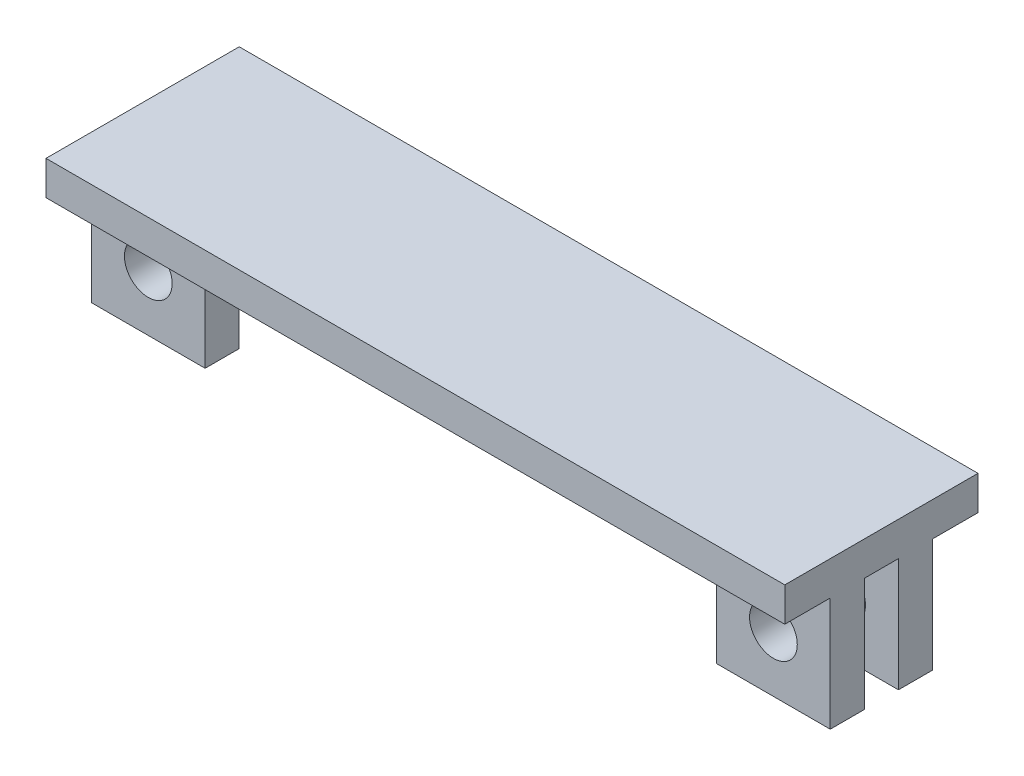
ISO-10303-21;
HEADER;
FILE_DESCRIPTION(('STEP AP214'),'2;1');
FILE_NAME('part.step','',(''),(''),'','','');
FILE_SCHEMA(('AUTOMOTIVE_DESIGN { 1 0 10303 214 1 1 1 1 }'));
ENDSEC;
DATA;
#1=APPLICATION_CONTEXT('core data for automotive mechanical design processes');
#2=APPLICATION_PROTOCOL_DEFINITION('international standard','automotive_design',2000,#1);
#3=PRODUCT_CONTEXT('',#1,'mechanical');
#4=PRODUCT('Part','Part','',(#3));
#5=PRODUCT_RELATED_PRODUCT_CATEGORY('part','',(#4));
#6=PRODUCT_DEFINITION_FORMATION('','',#4);
#7=PRODUCT_DEFINITION_CONTEXT('part definition',#1,'design');
#8=PRODUCT_DEFINITION('design','',#6,#7);
#9=PRODUCT_DEFINITION_SHAPE('','',#8);
#10=(LENGTH_UNIT() NAMED_UNIT(*) SI_UNIT(.MILLI.,.METRE.));
#11=(NAMED_UNIT(*) PLANE_ANGLE_UNIT() SI_UNIT($,.RADIAN.));
#12=(NAMED_UNIT(*) SI_UNIT($,.STERADIAN.) SOLID_ANGLE_UNIT());
#13=UNCERTAINTY_MEASURE_WITH_UNIT(LENGTH_MEASURE(1.E-05),#10,'distance_accuracy_value','');
#14=(GEOMETRIC_REPRESENTATION_CONTEXT(3) GLOBAL_UNCERTAINTY_ASSIGNED_CONTEXT((#13)) GLOBAL_UNIT_ASSIGNED_CONTEXT((#10,
#11,#12)) REPRESENTATION_CONTEXT('',''));
#15=CARTESIAN_POINT('',(0.,0.,0.));
#16=DIRECTION('',(0.,0.,1.));
#17=DIRECTION('',(1.,0.,0.));
#18=AXIS2_PLACEMENT_3D('',#15,#16,#17);
#19=CARTESIAN_POINT('',(-5.,10.,1.5));
#20=DIRECTION('',(0.,0.,-1.));
#21=DIRECTION('',(-1.,0.,0.));
#22=AXIS2_PLACEMENT_3D('',#19,#20,#21);
#23=PLANE('',#22);
#24=CARTESIAN_POINT('',(0.,5.,1.5));
#25=DIRECTION('',(0.,0.,1.));
#26=DIRECTION('',(1.,0.,0.));
#27=AXIS2_PLACEMENT_3D('',#24,#25,#26);
#28=CIRCLE('',#27,2.1);
#29=CARTESIAN_POINT('',(2.1,5.,1.5));
#30=VERTEX_POINT('',#29);
#31=EDGE_CURVE('E237',#30,#30,#28,.T.);
#32=ORIENTED_EDGE('',*,*,#31,.F.);
#33=EDGE_LOOP('',(#32));
#34=FACE_BOUND('',#33,.T.);
#35=DIRECTION('',(1.,0.,0.));
#36=VECTOR('',#35,1.);
#37=CARTESIAN_POINT('',(-5.,10.,1.5));
#38=LINE('',#37,#36);
#39=CARTESIAN_POINT('',(-5.,10.,1.5));
#40=VERTEX_POINT('',#39);
#41=CARTESIAN_POINT('',(5.,10.,1.5));
#42=VERTEX_POINT('',#41);
#43=EDGE_CURVE('E51',#40,#42,#38,.T.);
#44=ORIENTED_EDGE('',*,*,#43,.F.);
#45=DIRECTION('',(0.,-1.,0.));
#46=VECTOR('',#45,1.);
#47=CARTESIAN_POINT('',(-5.,10.,1.5));
#48=LINE('',#47,#46);
#49=CARTESIAN_POINT('',(-5.,0.,1.5));
#50=VERTEX_POINT('',#49);
#51=EDGE_CURVE('E205',#40,#50,#48,.T.);
#52=ORIENTED_EDGE('',*,*,#51,.T.);
#53=DIRECTION('',(1.,0.,0.));
#54=VECTOR('',#53,1.);
#55=CARTESIAN_POINT('',(-5.,0.,1.5));
#56=LINE('',#55,#54);
#57=CARTESIAN_POINT('',(5.,0.,1.5));
#58=VERTEX_POINT('',#57);
#59=EDGE_CURVE('E389',#50,#58,#56,.T.);
#60=ORIENTED_EDGE('',*,*,#59,.T.);
#61=DIRECTION('',(0.,-1.,0.));
#62=VECTOR('',#61,1.);
#63=CARTESIAN_POINT('',(5.,10.,1.5));
#64=LINE('',#63,#62);
#65=EDGE_CURVE('E393',#42,#58,#64,.T.);
#66=ORIENTED_EDGE('',*,*,#65,.F.);
#67=EDGE_LOOP('',(#44,#52,#60,#66));
#68=FACE_BOUND('',#67,.T.);
#69=ADVANCED_FACE('F39',(#34,#68),#23,.F.);
#70=CARTESIAN_POINT('',(55.,5.,1.5));
#71=DIRECTION('',(0.,0.,1.));
#72=DIRECTION('',(1.,0.,0.));
#73=AXIS2_PLACEMENT_3D('',#70,#71,#72);
#74=CIRCLE('',#73,2.1);
#75=CARTESIAN_POINT('',(57.1,5.,1.5));
#76=VERTEX_POINT('',#75);
#77=EDGE_CURVE('E236',#76,#76,#74,.T.);
#78=ORIENTED_EDGE('',*,*,#77,.F.);
#79=EDGE_LOOP('',(#78));
#80=FACE_BOUND('',#79,.T.);
#81=CARTESIAN_POINT('',(50.,10.,1.5));
#82=VERTEX_POINT('',#81);
#83=CARTESIAN_POINT('',(60.,10.,1.5));
#84=VERTEX_POINT('',#83);
#85=EDGE_CURVE('E11',#82,#84,#38,.T.);
#86=ORIENTED_EDGE('',*,*,#85,.F.);
#87=DIRECTION('',(0.,-1.,0.));
#88=VECTOR('',#87,1.);
#89=CARTESIAN_POINT('',(50.,10.,1.5));
#90=LINE('',#89,#88);
#91=CARTESIAN_POINT('',(50.,0.,1.5));
#92=VERTEX_POINT('',#91);
#93=EDGE_CURVE('E337',#82,#92,#90,.T.);
#94=ORIENTED_EDGE('',*,*,#93,.T.);
#95=DIRECTION('',(1.,0.,0.));
#96=VECTOR('',#95,1.);
#97=CARTESIAN_POINT('',(50.,0.,1.5));
#98=LINE('',#97,#96);
#99=CARTESIAN_POINT('',(60.,0.,1.5));
#100=VERTEX_POINT('',#99);
#101=EDGE_CURVE('E333',#92,#100,#98,.T.);
#102=ORIENTED_EDGE('',*,*,#101,.T.);
#103=DIRECTION('',(0.,-1.,0.));
#104=VECTOR('',#103,1.);
#105=CARTESIAN_POINT('',(60.,13.,1.5));
#106=LINE('',#105,#104);
#107=EDGE_CURVE('E380',#84,#100,#106,.T.);
#108=ORIENTED_EDGE('',*,*,#107,.F.);
#109=EDGE_LOOP('',(#86,#94,#102,#108));
#110=FACE_BOUND('',#109,.T.);
#111=ADVANCED_FACE('F436',(#80,#110),#23,.F.);
#112=CARTESIAN_POINT('',(-5.,13.,-7.5));
#113=DIRECTION('',(0.,0.,1.));
#114=DIRECTION('',(1.,0.,0.));
#115=AXIS2_PLACEMENT_3D('',#112,#113,#114);
#116=PLANE('',#115);
#117=CARTESIAN_POINT('',(55.,5.,-7.5));
#118=DIRECTION('',(0.,0.,1.));
#119=DIRECTION('',(1.,0.,0.));
#120=AXIS2_PLACEMENT_3D('',#117,#118,#119);
#121=CIRCLE('',#120,2.1);
#122=CARTESIAN_POINT('',(57.1,5.,-7.5));
#123=VERTEX_POINT('',#122);
#124=EDGE_CURVE('E249',#123,#123,#121,.T.);
#125=ORIENTED_EDGE('',*,*,#124,.T.);
#126=EDGE_LOOP('',(#125));
#127=FACE_BOUND('',#126,.T.);
#128=DIRECTION('',(-1.,0.,0.));
#129=VECTOR('',#128,1.);
#130=CARTESIAN_POINT('',(60.,10.,-7.5));
#131=LINE('',#130,#129);
#132=CARTESIAN_POINT('',(60.,10.,-7.5));
#133=VERTEX_POINT('',#132);
#134=CARTESIAN_POINT('',(50.,10.,-7.5));
#135=VERTEX_POINT('',#134);
#136=EDGE_CURVE('E65',#133,#135,#131,.T.);
#137=ORIENTED_EDGE('',*,*,#136,.F.);
#138=DIRECTION('',(0.,-1.,0.));
#139=VECTOR('',#138,1.);
#140=CARTESIAN_POINT('',(60.,13.,-7.5));
#141=LINE('',#140,#139);
#142=CARTESIAN_POINT('',(60.,0.,-7.5));
#143=VERTEX_POINT('',#142);
#144=EDGE_CURVE('E377',#133,#143,#141,.T.);
#145=ORIENTED_EDGE('',*,*,#144,.T.);
#146=DIRECTION('',(-1.,0.,0.));
#147=VECTOR('',#146,1.);
#148=CARTESIAN_POINT('',(50.,0.,-7.5));
#149=LINE('',#148,#147);
#150=CARTESIAN_POINT('',(50.,0.,-7.5));
#151=VERTEX_POINT('',#150);
#152=EDGE_CURVE('E274',#143,#151,#149,.T.);
#153=ORIENTED_EDGE('',*,*,#152,.T.);
#154=DIRECTION('',(0.,-1.,0.));
#155=VECTOR('',#154,1.);
#156=CARTESIAN_POINT('',(50.,10.,-7.5));
#157=LINE('',#156,#155);
#158=EDGE_CURVE('E289',#135,#151,#157,.T.);
#159=ORIENTED_EDGE('',*,*,#158,.F.);
#160=EDGE_LOOP('',(#137,#145,#153,#159));
#161=FACE_BOUND('',#160,.T.);
#162=ADVANCED_FACE('F433',(#127,#161),#116,.F.);
#163=CARTESIAN_POINT('',(0.,5.,-7.5));
#164=DIRECTION('',(0.,0.,1.));
#165=DIRECTION('',(1.,0.,0.));
#166=AXIS2_PLACEMENT_3D('',#163,#164,#165);
#167=CIRCLE('',#166,2.1);
#168=CARTESIAN_POINT('',(2.1,5.,-7.5));
#169=VERTEX_POINT('',#168);
#170=EDGE_CURVE('E253',#169,#169,#167,.T.);
#171=ORIENTED_EDGE('',*,*,#170,.T.);
#172=EDGE_LOOP('',(#171));
#173=FACE_BOUND('',#172,.T.);
#174=CARTESIAN_POINT('',(5.,10.,-7.5));
#175=VERTEX_POINT('',#174);
#176=CARTESIAN_POINT('',(-5.,10.,-7.5));
#177=VERTEX_POINT('',#176);
#178=EDGE_CURVE('E49',#175,#177,#131,.T.);
#179=ORIENTED_EDGE('',*,*,#178,.F.);
#180=DIRECTION('',(0.,-1.,0.));
#181=VECTOR('',#180,1.);
#182=CARTESIAN_POINT('',(5.,10.,-7.5));
#183=LINE('',#182,#181);
#184=CARTESIAN_POINT('',(5.,0.,-7.5));
#185=VERTEX_POINT('',#184);
#186=EDGE_CURVE('E323',#175,#185,#183,.T.);
#187=ORIENTED_EDGE('',*,*,#186,.T.);
#188=DIRECTION('',(-1.,0.,0.));
#189=VECTOR('',#188,1.);
#190=CARTESIAN_POINT('',(-5.,0.,-7.5));
#191=LINE('',#190,#189);
#192=CARTESIAN_POINT('',(-5.,0.,-7.5));
#193=VERTEX_POINT('',#192);
#194=EDGE_CURVE('E307',#185,#193,#191,.T.);
#195=ORIENTED_EDGE('',*,*,#194,.T.);
#196=DIRECTION('',(0.,-1.,0.));
#197=VECTOR('',#196,1.);
#198=CARTESIAN_POINT('',(-5.,13.,-7.5));
#199=LINE('',#198,#197);
#200=EDGE_CURVE('E369',#177,#193,#199,.T.);
#201=ORIENTED_EDGE('',*,*,#200,.F.);
#202=EDGE_LOOP('',(#179,#187,#195,#201));
#203=FACE_BOUND('',#202,.T.);
#204=ADVANCED_FACE('F435',(#173,#203),#116,.F.);
#205=CARTESIAN_POINT('',(0.,10.,0.));
#206=DIRECTION('',(0.,1.,0.));
#207=DIRECTION('',(0.,0.,1.));
#208=AXIS2_PLACEMENT_3D('',#205,#206,#207);
#209=PLANE('',#208);
#210=DIRECTION('',(0.,0.,1.));
#211=VECTOR('',#210,1.);
#212=CARTESIAN_POINT('',(50.,10.,-4.5));
#213=LINE('',#212,#211);
#214=CARTESIAN_POINT('',(50.,10.,-4.5));
#215=VERTEX_POINT('',#214);
#216=EDGE_CURVE('E262',#135,#215,#213,.T.);
#217=ORIENTED_EDGE('',*,*,#216,.T.);
#218=DIRECTION('',(1.,0.,0.));
#219=VECTOR('',#218,1.);
#220=CARTESIAN_POINT('',(50.,10.,-4.5));
#221=LINE('',#220,#219);
#222=CARTESIAN_POINT('',(60.,10.,-4.5));
#223=VERTEX_POINT('',#222);
#224=EDGE_CURVE('E265',#215,#223,#221,.T.);
#225=ORIENTED_EDGE('',*,*,#224,.T.);
#226=DIRECTION('',(0.,0.,-1.));
#227=VECTOR('',#226,1.);
#228=CARTESIAN_POINT('',(60.,10.,-7.5));
#229=LINE('',#228,#227);
#230=CARTESIAN_POINT('',(60.,10.,-1.5));
#231=VERTEX_POINT('',#230);
#232=EDGE_CURVE('E366',#231,#223,#229,.T.);
#233=ORIENTED_EDGE('',*,*,#232,.F.);
#234=DIRECTION('',(-1.,0.,0.));
#235=VECTOR('',#234,1.);
#236=CARTESIAN_POINT('',(50.,10.,-1.5));
#237=LINE('',#236,#235);
#238=CARTESIAN_POINT('',(50.,10.,-1.5));
#239=VERTEX_POINT('',#238);
#240=EDGE_CURVE('E328',#231,#239,#237,.T.);
#241=ORIENTED_EDGE('',*,*,#240,.T.);
#242=DIRECTION('',(0.,0.,1.));
#243=VECTOR('',#242,1.);
#244=CARTESIAN_POINT('',(50.,10.,1.5));
#245=LINE('',#244,#243);
#246=EDGE_CURVE('E332',#239,#82,#245,.T.);
#247=ORIENTED_EDGE('',*,*,#246,.T.);
#248=ORIENTED_EDGE('',*,*,#85,.T.);
#249=DIRECTION('',(0.,0.,-1.));
#250=VECTOR('',#249,1.);
#251=CARTESIAN_POINT('',(60.,10.,5.5));
#252=LINE('',#251,#250);
#253=CARTESIAN_POINT('',(60.,10.,5.5));
#254=VERTEX_POINT('',#253);
#255=EDGE_CURVE('E187',#254,#84,#252,.T.);
#256=ORIENTED_EDGE('',*,*,#255,.F.);
#257=DIRECTION('',(1.,0.,0.));
#258=VECTOR('',#257,1.);
#259=CARTESIAN_POINT('',(-5.,10.,5.5));
#260=LINE('',#259,#258);
#261=CARTESIAN_POINT('',(-5.,10.,5.5));
#262=VERTEX_POINT('',#261);
#263=EDGE_CURVE('E180',#262,#254,#260,.T.);
#264=ORIENTED_EDGE('',*,*,#263,.F.);
#265=DIRECTION('',(0.,0.,-1.));
#266=VECTOR('',#265,1.);
#267=CARTESIAN_POINT('',(-5.,10.,5.5));
#268=LINE('',#267,#266);
#269=EDGE_CURVE('E185',#262,#40,#268,.T.);
#270=ORIENTED_EDGE('',*,*,#269,.T.);
#271=ORIENTED_EDGE('',*,*,#43,.T.);
#272=DIRECTION('',(0.,0.,-1.));
#273=VECTOR('',#272,1.);
#274=CARTESIAN_POINT('',(5.,10.,1.5));
#275=LINE('',#274,#273);
#276=CARTESIAN_POINT('',(5.,10.,-1.5));
#277=VERTEX_POINT('',#276);
#278=EDGE_CURVE('E384',#42,#277,#275,.T.);
#279=ORIENTED_EDGE('',*,*,#278,.T.);
#280=DIRECTION('',(-1.,0.,0.));
#281=VECTOR('',#280,1.);
#282=CARTESIAN_POINT('',(-5.,10.,-1.5));
#283=LINE('',#282,#281);
#284=CARTESIAN_POINT('',(-5.,10.,-1.5));
#285=VERTEX_POINT('',#284);
#286=EDGE_CURVE('E388',#277,#285,#283,.T.);
#287=ORIENTED_EDGE('',*,*,#286,.T.);
#288=DIRECTION('',(0.,0.,1.));
#289=VECTOR('',#288,1.);
#290=CARTESIAN_POINT('',(-5.,10.,-7.5));
#291=LINE('',#290,#289);
#292=CARTESIAN_POINT('',(-5.,10.,-4.5));
#293=VERTEX_POINT('',#292);
#294=EDGE_CURVE('E361',#293,#285,#291,.T.);
#295=ORIENTED_EDGE('',*,*,#294,.F.);
#296=DIRECTION('',(1.,0.,0.));
#297=VECTOR('',#296,1.);
#298=CARTESIAN_POINT('',(-5.,10.,-4.5));
#299=LINE('',#298,#297);
#300=CARTESIAN_POINT('',(5.,10.,-4.5));
#301=VERTEX_POINT('',#300);
#302=EDGE_CURVE('E298',#293,#301,#299,.T.);
#303=ORIENTED_EDGE('',*,*,#302,.T.);
#304=DIRECTION('',(0.,0.,-1.));
#305=VECTOR('',#304,1.);
#306=CARTESIAN_POINT('',(5.,10.,-4.5));
#307=LINE('',#306,#305);
#308=EDGE_CURVE('E294',#301,#175,#307,.T.);
#309=ORIENTED_EDGE('',*,*,#308,.T.);
#310=ORIENTED_EDGE('',*,*,#178,.T.);
#311=DIRECTION('',(0.,0.,1.));
#312=VECTOR('',#311,1.);
#313=CARTESIAN_POINT('',(-5.,10.,-11.5));
#314=LINE('',#313,#312);
#315=CARTESIAN_POINT('',(-5.,10.,-11.5));
#316=VERTEX_POINT('',#315);
#317=EDGE_CURVE('E227',#316,#177,#314,.T.);
#318=ORIENTED_EDGE('',*,*,#317,.F.);
#319=DIRECTION('',(-1.,0.,0.));
#320=VECTOR('',#319,1.);
#321=CARTESIAN_POINT('',(60.,10.,-11.5));
#322=LINE('',#321,#320);
#323=CARTESIAN_POINT('',(60.,10.,-11.5));
#324=VERTEX_POINT('',#323);
#325=EDGE_CURVE('E217',#324,#316,#322,.T.);
#326=ORIENTED_EDGE('',*,*,#325,.F.);
#327=DIRECTION('',(0.,0.,1.));
#328=VECTOR('',#327,1.);
#329=CARTESIAN_POINT('',(60.,10.,-11.5));
#330=LINE('',#329,#328);
#331=EDGE_CURVE('E232',#324,#133,#330,.T.);
#332=ORIENTED_EDGE('',*,*,#331,.T.);
#333=ORIENTED_EDGE('',*,*,#136,.T.);
#334=EDGE_LOOP('',(#217,#225,#233,#241,#247,#248,#256,#264,#270,#271,#279,#287,#295,#303,#309,
#310,#318,#326,#332,#333));
#335=FACE_BOUND('',#334,.T.);
#336=ADVANCED_FACE('F183',(#335),#209,.F.);
#337=CARTESIAN_POINT('',(5.,10.,1.5));
#338=DIRECTION('',(-1.,0.,0.));
#339=DIRECTION('',(0.,0.,1.));
#340=AXIS2_PLACEMENT_3D('',#337,#338,#339);
#341=PLANE('',#340);
#342=DIRECTION('',(0.,0.,-1.));
#343=VECTOR('',#342,1.);
#344=CARTESIAN_POINT('',(5.,0.,1.5));
#345=LINE('',#344,#343);
#346=CARTESIAN_POINT('',(5.,0.,-1.5));
#347=VERTEX_POINT('',#346);
#348=EDGE_CURVE('E383',#58,#347,#345,.T.);
#349=ORIENTED_EDGE('',*,*,#348,.T.);
#350=DIRECTION('',(0.,-1.,0.));
#351=VECTOR('',#350,1.);
#352=CARTESIAN_POINT('',(5.,10.,-1.5));
#353=LINE('',#352,#351);
#354=EDGE_CURVE('E414',#277,#347,#353,.T.);
#355=ORIENTED_EDGE('',*,*,#354,.F.);
#356=ORIENTED_EDGE('',*,*,#278,.F.);
#357=ORIENTED_EDGE('',*,*,#65,.T.);
#358=EDGE_LOOP('',(#349,#355,#356,#357));
#359=FACE_BOUND('',#358,.T.);
#360=ADVANCED_FACE('F41',(#359),#341,.F.);
#361=CARTESIAN_POINT('',(-5.,10.,-1.5));
#362=DIRECTION('',(0.,0.,1.));
#363=DIRECTION('',(1.,0.,0.));
#364=AXIS2_PLACEMENT_3D('',#361,#362,#363);
#365=PLANE('',#364);
#366=CARTESIAN_POINT('',(0.,5.,-1.5));
#367=DIRECTION('',(0.,0.,1.));
#368=DIRECTION('',(1.,0.,0.));
#369=AXIS2_PLACEMENT_3D('',#366,#367,#368);
#370=CIRCLE('',#369,2.1);
#371=CARTESIAN_POINT('',(2.1,5.,-1.5));
#372=VERTEX_POINT('',#371);
#373=EDGE_CURVE('E257',#372,#372,#370,.T.);
#374=ORIENTED_EDGE('',*,*,#373,.T.);
#375=EDGE_LOOP('',(#374));
#376=FACE_BOUND('',#375,.T.);
#377=DIRECTION('',(-1.,0.,0.));
#378=VECTOR('',#377,1.);
#379=CARTESIAN_POINT('',(-5.,0.,-1.5));
#380=LINE('',#379,#378);
#381=CARTESIAN_POINT('',(-5.,0.,-1.5));
#382=VERTEX_POINT('',#381);
#383=EDGE_CURVE('E397',#347,#382,#380,.T.);
#384=ORIENTED_EDGE('',*,*,#383,.T.);
#385=DIRECTION('',(0.,-1.,0.));
#386=VECTOR('',#385,1.);
#387=CARTESIAN_POINT('',(-5.,10.,-1.5));
#388=LINE('',#387,#386);
#389=EDGE_CURVE('E410',#285,#382,#388,.T.);
#390=ORIENTED_EDGE('',*,*,#389,.F.);
#391=ORIENTED_EDGE('',*,*,#286,.F.);
#392=ORIENTED_EDGE('',*,*,#354,.T.);
#393=EDGE_LOOP('',(#384,#390,#391,#392));
#394=FACE_BOUND('',#393,.T.);
#395=ADVANCED_FACE('F456',(#376,#394),#365,.F.);
#396=CARTESIAN_POINT('',(-5.,10.,1.5));
#397=DIRECTION('',(1.,0.,0.));
#398=DIRECTION('',(0.,0.,-1.));
#399=AXIS2_PLACEMENT_3D('',#396,#397,#398);
#400=PLANE('',#399);
#401=DIRECTION('',(0.,0.,1.));
#402=VECTOR('',#401,1.);
#403=CARTESIAN_POINT('',(-5.,0.,1.5));
#404=LINE('',#403,#402);
#405=EDGE_CURVE('E400',#382,#50,#404,.T.);
#406=ORIENTED_EDGE('',*,*,#405,.T.);
#407=ORIENTED_EDGE('',*,*,#51,.F.);
#408=ORIENTED_EDGE('',*,*,#269,.F.);
#409=DIRECTION('',(0.,-1.,0.));
#410=VECTOR('',#409,1.);
#411=CARTESIAN_POINT('',(-5.,13.,5.5));
#412=LINE('',#411,#410);
#413=CARTESIAN_POINT('',(-5.,13.,5.5));
#414=VERTEX_POINT('',#413);
#415=EDGE_CURVE('E193',#414,#262,#412,.T.);
#416=ORIENTED_EDGE('',*,*,#415,.F.);
#417=DIRECTION('',(0.,0.,1.));
#418=VECTOR('',#417,1.);
#419=CARTESIAN_POINT('',(-5.,13.,-7.5));
#420=LINE('',#419,#418);
#421=CARTESIAN_POINT('',(-5.,13.,-11.5));
#422=VERTEX_POINT('',#421);
#423=EDGE_CURVE('E362',#422,#414,#420,.T.);
#424=ORIENTED_EDGE('',*,*,#423,.F.);
#425=DIRECTION('',(0.,1.,0.));
#426=VECTOR('',#425,1.);
#427=CARTESIAN_POINT('',(-5.,13.,-11.5));
#428=LINE('',#427,#426);
#429=EDGE_CURVE('E220',#316,#422,#428,.T.);
#430=ORIENTED_EDGE('',*,*,#429,.F.);
#431=ORIENTED_EDGE('',*,*,#317,.T.);
#432=ORIENTED_EDGE('',*,*,#200,.T.);
#433=DIRECTION('',(0.,0.,1.));
#434=VECTOR('',#433,1.);
#435=CARTESIAN_POINT('',(-5.,0.,-4.5));
#436=LINE('',#435,#434);
#437=CARTESIAN_POINT('',(-5.,0.,-4.5));
#438=VERTEX_POINT('',#437);
#439=EDGE_CURVE('E311',#193,#438,#436,.T.);
#440=ORIENTED_EDGE('',*,*,#439,.T.);
#441=DIRECTION('',(0.,-1.,0.));
#442=VECTOR('',#441,1.);
#443=CARTESIAN_POINT('',(-5.,10.,-4.5));
#444=LINE('',#443,#442);
#445=EDGE_CURVE('E319',#293,#438,#444,.T.);
#446=ORIENTED_EDGE('',*,*,#445,.F.);
#447=ORIENTED_EDGE('',*,*,#294,.T.);
#448=ORIENTED_EDGE('',*,*,#389,.T.);
#449=EDGE_LOOP('',(#406,#407,#408,#416,#424,#430,#431,#432,#440,#446,#447,#448));
#450=FACE_BOUND('',#449,.T.);
#451=ADVANCED_FACE('F204',(#450),#400,.F.);
#452=CARTESIAN_POINT('',(0.,0.,0.));
#453=DIRECTION('',(0.,-1.,0.));
#454=DIRECTION('',(0.,0.,-1.));
#455=AXIS2_PLACEMENT_3D('',#452,#453,#454);
#456=PLANE('',#455);
#457=ORIENTED_EDGE('',*,*,#348,.F.);
#458=ORIENTED_EDGE('',*,*,#59,.F.);
#459=ORIENTED_EDGE('',*,*,#405,.F.);
#460=ORIENTED_EDGE('',*,*,#383,.F.);
#461=EDGE_LOOP('',(#457,#458,#459,#460));
#462=FACE_BOUND('',#461,.T.);
#463=ADVANCED_FACE('F454',(#462),#456,.T.);
#464=CARTESIAN_POINT('',(60.,13.,-7.5));
#465=DIRECTION('',(-1.,0.,0.));
#466=DIRECTION('',(0.,0.,1.));
#467=AXIS2_PLACEMENT_3D('',#464,#465,#466);
#468=PLANE('',#467);
#469=DIRECTION('',(0.,0.,-1.));
#470=VECTOR('',#469,1.);
#471=CARTESIAN_POINT('',(60.,13.,-7.5));
#472=LINE('',#471,#470);
#473=CARTESIAN_POINT('',(60.,13.,5.5));
#474=VERTEX_POINT('',#473);
#475=CARTESIAN_POINT('',(60.,13.,-11.5));
#476=VERTEX_POINT('',#475);
#477=EDGE_CURVE('E365',#474,#476,#472,.T.);
#478=ORIENTED_EDGE('',*,*,#477,.F.);
#479=DIRECTION('',(0.,1.,0.));
#480=VECTOR('',#479,1.);
#481=CARTESIAN_POINT('',(60.,13.,5.5));
#482=LINE('',#481,#480);
#483=EDGE_CURVE('E192',#254,#474,#482,.T.);
#484=ORIENTED_EDGE('',*,*,#483,.F.);
#485=ORIENTED_EDGE('',*,*,#255,.T.);
#486=ORIENTED_EDGE('',*,*,#107,.T.);
#487=DIRECTION('',(0.,0.,-1.));
#488=VECTOR('',#487,1.);
#489=CARTESIAN_POINT('',(60.,0.,1.5));
#490=LINE('',#489,#488);
#491=CARTESIAN_POINT('',(60.,0.,-1.5));
#492=VERTEX_POINT('',#491);
#493=EDGE_CURVE('E327',#100,#492,#490,.T.);
#494=ORIENTED_EDGE('',*,*,#493,.T.);
#495=DIRECTION('',(0.,-1.,0.));
#496=VECTOR('',#495,1.);
#497=CARTESIAN_POINT('',(60.,10.,-1.5));
#498=LINE('',#497,#496);
#499=EDGE_CURVE('E357',#231,#492,#498,.T.);
#500=ORIENTED_EDGE('',*,*,#499,.F.);
#501=ORIENTED_EDGE('',*,*,#232,.T.);
#502=DIRECTION('',(0.,-1.,0.));
#503=VECTOR('',#502,1.);
#504=CARTESIAN_POINT('',(60.,10.,-4.5));
#505=LINE('',#504,#503);
#506=CARTESIAN_POINT('',(60.,0.,-4.5));
#507=VERTEX_POINT('',#506);
#508=EDGE_CURVE('E270',#223,#507,#505,.T.);
#509=ORIENTED_EDGE('',*,*,#508,.T.);
#510=DIRECTION('',(0.,0.,-1.));
#511=VECTOR('',#510,1.);
#512=CARTESIAN_POINT('',(60.,0.,-4.5));
#513=LINE('',#512,#511);
#514=EDGE_CURVE('E261',#507,#143,#513,.T.);
#515=ORIENTED_EDGE('',*,*,#514,.T.);
#516=ORIENTED_EDGE('',*,*,#144,.F.);
#517=ORIENTED_EDGE('',*,*,#331,.F.);
#518=DIRECTION('',(0.,-1.,0.));
#519=VECTOR('',#518,1.);
#520=CARTESIAN_POINT('',(60.,13.,-11.5));
#521=LINE('',#520,#519);
#522=EDGE_CURVE('E210',#476,#324,#521,.T.);
#523=ORIENTED_EDGE('',*,*,#522,.F.);
#524=EDGE_LOOP('',(#478,#484,#485,#486,#494,#500,#501,#509,#515,#516,#517,#523));
#525=FACE_BOUND('',#524,.T.);
#526=ADVANCED_FACE('F524',(#525),#468,.F.);
#527=CARTESIAN_POINT('',(0.,13.,0.));
#528=DIRECTION('',(0.,1.,0.));
#529=DIRECTION('',(0.,0.,1.));
#530=AXIS2_PLACEMENT_3D('',#527,#528,#529);
#531=PLANE('',#530);
#532=ORIENTED_EDGE('',*,*,#423,.T.);
#533=DIRECTION('',(-1.,0.,0.));
#534=VECTOR('',#533,1.);
#535=CARTESIAN_POINT('',(-5.,13.,5.5));
#536=LINE('',#535,#534);
#537=EDGE_CURVE('E199',#474,#414,#536,.T.);
#538=ORIENTED_EDGE('',*,*,#537,.F.);
#539=ORIENTED_EDGE('',*,*,#477,.T.);
#540=DIRECTION('',(1.,0.,0.));
#541=VECTOR('',#540,1.);
#542=CARTESIAN_POINT('',(60.,13.,-11.5));
#543=LINE('',#542,#541);
#544=EDGE_CURVE('E224',#422,#476,#543,.T.);
#545=ORIENTED_EDGE('',*,*,#544,.F.);
#546=EDGE_LOOP('',(#532,#538,#539,#545));
#547=FACE_BOUND('',#546,.T.);
#548=ADVANCED_FACE('F480',(#547),#531,.T.);
#549=CARTESIAN_POINT('',(50.,10.,-1.5));
#550=DIRECTION('',(0.,0.,1.));
#551=DIRECTION('',(1.,0.,0.));
#552=AXIS2_PLACEMENT_3D('',#549,#550,#551);
#553=PLANE('',#552);
#554=CARTESIAN_POINT('',(55.,5.,-1.5));
#555=DIRECTION('',(0.,0.,1.));
#556=DIRECTION('',(1.,0.,0.));
#557=AXIS2_PLACEMENT_3D('',#554,#555,#556);
#558=CIRCLE('',#557,2.1);
#559=CARTESIAN_POINT('',(57.1,5.,-1.5));
#560=VERTEX_POINT('',#559);
#561=EDGE_CURVE('E245',#560,#560,#558,.T.);
#562=ORIENTED_EDGE('',*,*,#561,.T.);
#563=EDGE_LOOP('',(#562));
#564=FACE_BOUND('',#563,.T.);
#565=DIRECTION('',(-1.,0.,0.));
#566=VECTOR('',#565,1.);
#567=CARTESIAN_POINT('',(50.,0.,-1.5));
#568=LINE('',#567,#566);
#569=CARTESIAN_POINT('',(50.,0.,-1.5));
#570=VERTEX_POINT('',#569);
#571=EDGE_CURVE('E341',#492,#570,#568,.T.);
#572=ORIENTED_EDGE('',*,*,#571,.T.);
#573=DIRECTION('',(0.,-1.,0.));
#574=VECTOR('',#573,1.);
#575=CARTESIAN_POINT('',(50.,10.,-1.5));
#576=LINE('',#575,#574);
#577=EDGE_CURVE('E353',#239,#570,#576,.T.);
#578=ORIENTED_EDGE('',*,*,#577,.F.);
#579=ORIENTED_EDGE('',*,*,#240,.F.);
#580=ORIENTED_EDGE('',*,*,#499,.T.);
#581=EDGE_LOOP('',(#572,#578,#579,#580));
#582=FACE_BOUND('',#581,.T.);
#583=ADVANCED_FACE('F518',(#564,#582),#553,.F.);
#584=CARTESIAN_POINT('',(50.,10.,1.5));
#585=DIRECTION('',(1.,0.,0.));
#586=DIRECTION('',(0.,0.,-1.));
#587=AXIS2_PLACEMENT_3D('',#584,#585,#586);
#588=PLANE('',#587);
#589=DIRECTION('',(0.,0.,1.));
#590=VECTOR('',#589,1.);
#591=CARTESIAN_POINT('',(50.,0.,1.5));
#592=LINE('',#591,#590);
#593=EDGE_CURVE('E344',#570,#92,#592,.T.);
#594=ORIENTED_EDGE('',*,*,#593,.T.);
#595=ORIENTED_EDGE('',*,*,#93,.F.);
#596=ORIENTED_EDGE('',*,*,#246,.F.);
#597=ORIENTED_EDGE('',*,*,#577,.T.);
#598=EDGE_LOOP('',(#594,#595,#596,#597));
#599=FACE_BOUND('',#598,.T.);
#600=ADVANCED_FACE('F511',(#599),#588,.F.);
#601=CARTESIAN_POINT('',(0.,0.,0.));
#602=DIRECTION('',(0.,-1.,0.));
#603=DIRECTION('',(0.,0.,-1.));
#604=AXIS2_PLACEMENT_3D('',#601,#602,#603);
#605=PLANE('',#604);
#606=ORIENTED_EDGE('',*,*,#493,.F.);
#607=ORIENTED_EDGE('',*,*,#101,.F.);
#608=ORIENTED_EDGE('',*,*,#593,.F.);
#609=ORIENTED_EDGE('',*,*,#571,.F.);
#610=EDGE_LOOP('',(#606,#607,#608,#609));
#611=FACE_BOUND('',#610,.T.);
#612=ADVANCED_FACE('F503',(#611),#605,.T.);
#613=CARTESIAN_POINT('',(5.,10.,-4.5));
#614=DIRECTION('',(-1.,0.,0.));
#615=DIRECTION('',(0.,0.,1.));
#616=AXIS2_PLACEMENT_3D('',#613,#614,#615);
#617=PLANE('',#616);
#618=DIRECTION('',(0.,0.,-1.));
#619=VECTOR('',#618,1.);
#620=CARTESIAN_POINT('',(5.,0.,-4.5));
#621=LINE('',#620,#619);
#622=CARTESIAN_POINT('',(5.,0.,-4.5));
#623=VERTEX_POINT('',#622);
#624=EDGE_CURVE('E293',#623,#185,#621,.T.);
#625=ORIENTED_EDGE('',*,*,#624,.T.);
#626=ORIENTED_EDGE('',*,*,#186,.F.);
#627=ORIENTED_EDGE('',*,*,#308,.F.);
#628=DIRECTION('',(0.,-1.,0.));
#629=VECTOR('',#628,1.);
#630=CARTESIAN_POINT('',(5.,10.,-4.5));
#631=LINE('',#630,#629);
#632=EDGE_CURVE('E303',#301,#623,#631,.T.);
#633=ORIENTED_EDGE('',*,*,#632,.T.);
#634=EDGE_LOOP('',(#625,#626,#627,#633));
#635=FACE_BOUND('',#634,.T.);
#636=ADVANCED_FACE('F501',(#635),#617,.F.);
#637=CARTESIAN_POINT('',(-5.,10.,-4.5));
#638=DIRECTION('',(0.,0.,-1.));
#639=DIRECTION('',(-1.,0.,0.));
#640=AXIS2_PLACEMENT_3D('',#637,#638,#639);
#641=PLANE('',#640);
#642=CARTESIAN_POINT('',(0.,5.,-4.5));
#643=DIRECTION('',(0.,0.,-1.));
#644=DIRECTION('',(-1.,0.,0.));
#645=AXIS2_PLACEMENT_3D('',#642,#643,#644);
#646=CIRCLE('',#645,2.1);
#647=CARTESIAN_POINT('',(-2.1,5.,-4.5));
#648=VERTEX_POINT('',#647);
#649=EDGE_CURVE('E43',#648,#648,#646,.T.);
#650=ORIENTED_EDGE('',*,*,#649,.T.);
#651=EDGE_LOOP('',(#650));
#652=FACE_BOUND('',#651,.T.);
#653=DIRECTION('',(1.,0.,0.));
#654=VECTOR('',#653,1.);
#655=CARTESIAN_POINT('',(-5.,0.,-4.5));
#656=LINE('',#655,#654);
#657=EDGE_CURVE('E299',#438,#623,#656,.T.);
#658=ORIENTED_EDGE('',*,*,#657,.T.);
#659=ORIENTED_EDGE('',*,*,#632,.F.);
#660=ORIENTED_EDGE('',*,*,#302,.F.);
#661=ORIENTED_EDGE('',*,*,#445,.T.);
#662=EDGE_LOOP('',(#658,#659,#660,#661));
#663=FACE_BOUND('',#662,.T.);
#664=ADVANCED_FACE('F497',(#652,#663),#641,.F.);
#665=CARTESIAN_POINT('',(0.,0.,0.));
#666=DIRECTION('',(0.,-1.,0.));
#667=DIRECTION('',(0.,0.,-1.));
#668=AXIS2_PLACEMENT_3D('',#665,#666,#667);
#669=PLANE('',#668);
#670=ORIENTED_EDGE('',*,*,#624,.F.);
#671=ORIENTED_EDGE('',*,*,#657,.F.);
#672=ORIENTED_EDGE('',*,*,#439,.F.);
#673=ORIENTED_EDGE('',*,*,#194,.F.);
#674=EDGE_LOOP('',(#670,#671,#672,#673));
#675=FACE_BOUND('',#674,.T.);
#676=ADVANCED_FACE('F495',(#675),#669,.T.);
#677=CARTESIAN_POINT('',(50.,10.,-4.5));
#678=DIRECTION('',(1.,0.,0.));
#679=DIRECTION('',(0.,0.,-1.));
#680=AXIS2_PLACEMENT_3D('',#677,#678,#679);
#681=PLANE('',#680);
#682=DIRECTION('',(0.,0.,1.));
#683=VECTOR('',#682,1.);
#684=CARTESIAN_POINT('',(50.,0.,-4.5));
#685=LINE('',#684,#683);
#686=CARTESIAN_POINT('',(50.,0.,-4.5));
#687=VERTEX_POINT('',#686);
#688=EDGE_CURVE('E277',#151,#687,#685,.T.);
#689=ORIENTED_EDGE('',*,*,#688,.T.);
#690=DIRECTION('',(0.,-1.,0.));
#691=VECTOR('',#690,1.);
#692=CARTESIAN_POINT('',(50.,10.,-4.5));
#693=LINE('',#692,#691);
#694=EDGE_CURVE('E285',#215,#687,#693,.T.);
#695=ORIENTED_EDGE('',*,*,#694,.F.);
#696=ORIENTED_EDGE('',*,*,#216,.F.);
#697=ORIENTED_EDGE('',*,*,#158,.T.);
#698=EDGE_LOOP('',(#689,#695,#696,#697));
#699=FACE_BOUND('',#698,.T.);
#700=ADVANCED_FACE('F622',(#699),#681,.F.);
#701=CARTESIAN_POINT('',(50.,10.,-4.5));
#702=DIRECTION('',(0.,0.,-1.));
#703=DIRECTION('',(-1.,0.,0.));
#704=AXIS2_PLACEMENT_3D('',#701,#702,#703);
#705=PLANE('',#704);
#706=CARTESIAN_POINT('',(55.,5.,-4.5));
#707=DIRECTION('',(0.,0.,-1.));
#708=DIRECTION('',(-1.,0.,0.));
#709=AXIS2_PLACEMENT_3D('',#706,#707,#708);
#710=CIRCLE('',#709,2.1);
#711=CARTESIAN_POINT('',(52.9,5.,-4.5));
#712=VERTEX_POINT('',#711);
#713=EDGE_CURVE('E241',#712,#712,#710,.T.);
#714=ORIENTED_EDGE('',*,*,#713,.T.);
#715=EDGE_LOOP('',(#714));
#716=FACE_BOUND('',#715,.T.);
#717=DIRECTION('',(1.,0.,0.));
#718=VECTOR('',#717,1.);
#719=CARTESIAN_POINT('',(50.,0.,-4.5));
#720=LINE('',#719,#718);
#721=EDGE_CURVE('E266',#687,#507,#720,.T.);
#722=ORIENTED_EDGE('',*,*,#721,.T.);
#723=ORIENTED_EDGE('',*,*,#508,.F.);
#724=ORIENTED_EDGE('',*,*,#224,.F.);
#725=ORIENTED_EDGE('',*,*,#694,.T.);
#726=EDGE_LOOP('',(#722,#723,#724,#725));
#727=FACE_BOUND('',#726,.T.);
#728=ADVANCED_FACE('F421',(#716,#727),#705,.F.);
#729=CARTESIAN_POINT('',(0.,0.,0.));
#730=DIRECTION('',(0.,-1.,0.));
#731=DIRECTION('',(0.,0.,-1.));
#732=AXIS2_PLACEMENT_3D('',#729,#730,#731);
#733=PLANE('',#732);
#734=ORIENTED_EDGE('',*,*,#514,.F.);
#735=ORIENTED_EDGE('',*,*,#721,.F.);
#736=ORIENTED_EDGE('',*,*,#688,.F.);
#737=ORIENTED_EDGE('',*,*,#152,.F.);
#738=EDGE_LOOP('',(#734,#735,#736,#737));
#739=FACE_BOUND('',#738,.T.);
#740=ADVANCED_FACE('F428',(#739),#733,.T.);
#741=CARTESIAN_POINT('',(55.,5.,-15.5));
#742=DIRECTION('',(0.,0.,1.));
#743=DIRECTION('',(1.,0.,0.));
#744=AXIS2_PLACEMENT_3D('',#741,#742,#743);
#745=CYLINDRICAL_SURFACE('',#744,2.1);
#746=ORIENTED_EDGE('',*,*,#713,.F.);
#747=EDGE_LOOP('',(#746));
#748=FACE_BOUND('',#747,.T.);
#749=ORIENTED_EDGE('',*,*,#124,.F.);
#750=EDGE_LOOP('',(#749));
#751=FACE_BOUND('',#750,.T.);
#752=ADVANCED_FACE('F424',(#748,#751),#745,.F.);
#753=CARTESIAN_POINT('',(0.,5.,-15.5));
#754=DIRECTION('',(0.,0.,1.));
#755=DIRECTION('',(1.,0.,0.));
#756=AXIS2_PLACEMENT_3D('',#753,#754,#755);
#757=CYLINDRICAL_SURFACE('',#756,2.1);
#758=ORIENTED_EDGE('',*,*,#649,.F.);
#759=EDGE_LOOP('',(#758));
#760=FACE_BOUND('',#759,.T.);
#761=ORIENTED_EDGE('',*,*,#170,.F.);
#762=EDGE_LOOP('',(#761));
#763=FACE_BOUND('',#762,.T.);
#764=ADVANCED_FACE('F427',(#760,#763),#757,.F.);
#765=ORIENTED_EDGE('',*,*,#77,.T.);
#766=EDGE_LOOP('',(#765));
#767=FACE_BOUND('',#766,.T.);
#768=ORIENTED_EDGE('',*,*,#561,.F.);
#769=EDGE_LOOP('',(#768));
#770=FACE_BOUND('',#769,.T.);
#771=ADVANCED_FACE('F430',(#767,#770),#745,.F.);
#772=ORIENTED_EDGE('',*,*,#31,.T.);
#773=EDGE_LOOP('',(#772));
#774=FACE_BOUND('',#773,.T.);
#775=ORIENTED_EDGE('',*,*,#373,.F.);
#776=EDGE_LOOP('',(#775));
#777=FACE_BOUND('',#776,.T.);
#778=ADVANCED_FACE('F583',(#774,#777),#757,.F.);
#779=CARTESIAN_POINT('',(0.,0.,-11.5));
#780=DIRECTION('',(0.,0.,-1.));
#781=DIRECTION('',(-1.,0.,0.));
#782=AXIS2_PLACEMENT_3D('',#779,#780,#781);
#783=PLANE('',#782);
#784=ORIENTED_EDGE('',*,*,#522,.T.);
#785=ORIENTED_EDGE('',*,*,#325,.T.);
#786=ORIENTED_EDGE('',*,*,#429,.T.);
#787=ORIENTED_EDGE('',*,*,#544,.T.);
#788=EDGE_LOOP('',(#784,#785,#786,#787));
#789=FACE_BOUND('',#788,.T.);
#790=ADVANCED_FACE('F484',(#789),#783,.T.);
#791=CARTESIAN_POINT('',(0.,0.,5.5));
#792=DIRECTION('',(0.,0.,1.));
#793=DIRECTION('',(1.,0.,0.));
#794=AXIS2_PLACEMENT_3D('',#791,#792,#793);
#795=PLANE('',#794);
#796=ORIENTED_EDGE('',*,*,#415,.T.);
#797=ORIENTED_EDGE('',*,*,#263,.T.);
#798=ORIENTED_EDGE('',*,*,#483,.T.);
#799=ORIENTED_EDGE('',*,*,#537,.T.);
#800=EDGE_LOOP('',(#796,#797,#798,#799));
#801=FACE_BOUND('',#800,.T.);
#802=ADVANCED_FACE('F197',(#801),#795,.T.);
#803=CLOSED_SHELL('',(#69,#111,#162,#204,#336,#360,#395,#451,#463,#526,#548,#583,#600,#612,#636,
#664,#676,#700,#728,#740,#752,#764,#771,#778,#790,#802));
#804=MANIFOLD_SOLID_BREP('B2',#803);
#805=ADVANCED_BREP_SHAPE_REPRESENTATION('',(#18,#804),#14);
#806=SHAPE_DEFINITION_REPRESENTATION(#9,#805);
ENDSEC;
END-ISO-10303-21;
